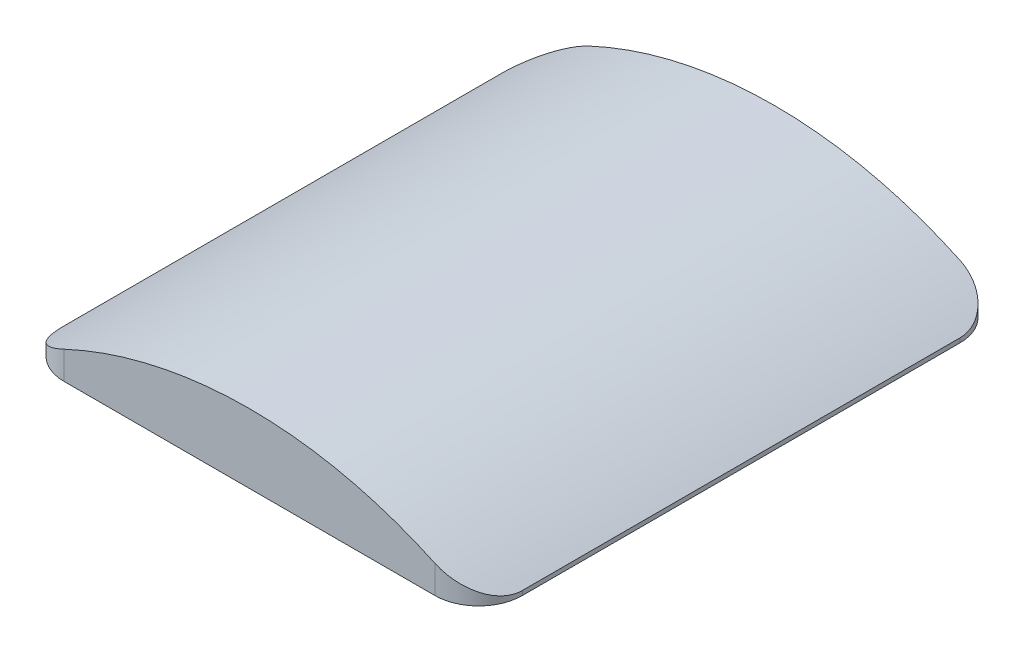
ISO-10303-21;
HEADER;
FILE_DESCRIPTION(('STEP AP214'),'2;1');
FILE_NAME('part.step','',(''),(''),'','','');
FILE_SCHEMA(('AUTOMOTIVE_DESIGN { 1 0 10303 214 1 1 1 1 }'));
ENDSEC;
DATA;
#1=APPLICATION_CONTEXT('core data for automotive mechanical design processes');
#2=APPLICATION_PROTOCOL_DEFINITION('international standard','automotive_design',2000,#1);
#3=PRODUCT_CONTEXT('',#1,'mechanical');
#4=PRODUCT('Part','Part','',(#3));
#5=PRODUCT_RELATED_PRODUCT_CATEGORY('part','',(#4));
#6=PRODUCT_DEFINITION_FORMATION('','',#4);
#7=PRODUCT_DEFINITION_CONTEXT('part definition',#1,'design');
#8=PRODUCT_DEFINITION('design','',#6,#7);
#9=PRODUCT_DEFINITION_SHAPE('','',#8);
#10=(LENGTH_UNIT() NAMED_UNIT(*) SI_UNIT(.MILLI.,.METRE.));
#11=(NAMED_UNIT(*) PLANE_ANGLE_UNIT() SI_UNIT($,.RADIAN.));
#12=(NAMED_UNIT(*) SI_UNIT($,.STERADIAN.) SOLID_ANGLE_UNIT());
#13=UNCERTAINTY_MEASURE_WITH_UNIT(LENGTH_MEASURE(1.E-05),#10,'distance_accuracy_value','');
#14=(GEOMETRIC_REPRESENTATION_CONTEXT(3) GLOBAL_UNCERTAINTY_ASSIGNED_CONTEXT((#13)) GLOBAL_UNIT_ASSIGNED_CONTEXT((#10,
#11,#12)) REPRESENTATION_CONTEXT('',''));
#15=CARTESIAN_POINT('',(0.,0.,0.));
#16=DIRECTION('',(0.,0.,1.));
#17=DIRECTION('',(1.,0.,0.));
#18=AXIS2_PLACEMENT_3D('',#15,#16,#17);
#19=CARTESIAN_POINT('',(0.,-111.055071696745,60.));
#20=DIRECTION('',(0.,0.,-1.));
#21=DIRECTION('',(-1.,0.,0.));
#22=AXIS2_PLACEMENT_3D('',#19,#20,#21);
#23=CYLINDRICAL_SURFACE('',#22,100.);
#24=DIRECTION('',(0.,0.,-1.));
#25=VECTOR('',#24,1.);
#26=CARTESIAN_POINT('',(-52.375,-25.8678697530253,60.));
#27=LINE('',#26,#25);
#28=CARTESIAN_POINT('',(-52.375,-25.8678697530253,50.));
#29=VERTEX_POINT('',#28);
#30=CARTESIAN_POINT('',(-52.375,-25.8678697530253,-50.));
#31=VERTEX_POINT('',#30);
#32=EDGE_CURVE('E115',#29,#31,#27,.T.);
#33=ORIENTED_EDGE('',*,*,#32,.F.);
#34=CARTESIAN_POINT('',(-52.375,-25.8678697530253,50.));
#35=CARTESIAN_POINT('',(-52.3750009471671,-25.8678707840457,50.1266693333499));
#36=CARTESIAN_POINT('',(-52.3725926924967,-25.8663896311386,50.2533213826519));
#37=CARTESIAN_POINT('',(-52.3629738020624,-25.8604766748798,50.506370588828));
#38=CARTESIAN_POINT('',(-52.3557632980753,-25.8560449524937,50.6327677526007));
#39=CARTESIAN_POINT('',(-52.3269649151145,-25.8383521672331,51.0110904456942));
#40=CARTESIAN_POINT('',(-52.2982101201286,-25.8206934489779,51.2623148478259));
#41=CARTESIAN_POINT('',(-52.2221814182102,-25.774090657108,51.7595421435745));
#42=CARTESIAN_POINT('',(-52.1750006156389,-25.7452033237094,52.0055648338298));
#43=CARTESIAN_POINT('',(-52.0627427729445,-25.6766485751876,52.4919742288888));
#44=CARTESIAN_POINT('',(-51.9976645765401,-25.636980463562,52.7323605684604));
#45=CARTESIAN_POINT('',(-51.8505459482255,-25.5475967589811,53.2055140409575));
#46=CARTESIAN_POINT('',(-51.7685327156521,-25.4978972802379,53.4382927065917));
#47=CARTESIAN_POINT('',(-51.5883881709189,-25.3891550745353,53.8953622575638));
#48=CARTESIAN_POINT('',(-51.490250721599,-25.3301087903317,54.1196498709079));
#49=CARTESIAN_POINT('',(-51.278834915068,-25.2034772376606,54.55863065259));
#50=CARTESIAN_POINT('',(-51.1655472272926,-25.1358867084719,54.7733177986938));
#51=CARTESIAN_POINT('',(-50.92489517716,-24.9930322165605,55.192075180805));
#52=CARTESIAN_POINT('',(-50.7975253887378,-24.9177652968704,55.396141279492));
#53=CARTESIAN_POINT('',(-50.5212367167712,-24.7554083369007,55.8054815393253));
#54=CARTESIAN_POINT('',(-50.3714610537722,-24.6678701842778,56.0100002644381));
#55=CARTESIAN_POINT('',(-50.0584399438832,-24.48610828394,56.4053412431879));
#56=CARTESIAN_POINT('',(-49.8951896311576,-24.3918821228517,56.5961585021601));
#57=CARTESIAN_POINT('',(-49.3870697603099,-24.1006626465862,57.1470412104243));
#58=CARTESIAN_POINT('',(-49.0236660675647,-23.8950306323007,57.4857798291961));
#59=CARTESIAN_POINT('',(-48.2032955590233,-23.438336042556,58.1452868881883));
#60=CARTESIAN_POINT('',(-47.740350021235,-23.184939689709,58.4569364854667));
#61=CARTESIAN_POINT('',(-46.7738158588621,-22.6666650527962,58.9976063158804));
#62=CARTESIAN_POINT('',(-46.2702031120208,-22.4017799978241,59.226577059905));
#63=CARTESIAN_POINT('',(-45.4823940445078,-21.9964129019381,59.5092880381407));
#64=CARTESIAN_POINT('',(-45.2084863291149,-21.8570384661203,59.5944552517181));
#65=CARTESIAN_POINT('',(-44.6542829057085,-21.5783089838926,59.7409938185742));
#66=CARTESIAN_POINT('',(-44.3739870781215,-21.4389539378948,59.8023647260429));
#67=CARTESIAN_POINT('',(-43.8088789160011,-21.1613508804501,59.9008185469047));
#68=CARTESIAN_POINT('',(-43.5240698003667,-21.0231021772759,59.9379180370159));
#69=CARTESIAN_POINT('',(-42.9514017286221,-20.7484906400652,59.9875116449344));
#70=CARTESIAN_POINT('',(-42.6635426166181,-20.6121279032551,60.000004498869));
#71=CARTESIAN_POINT('',(-42.375,-20.4771528919939,60.));
#72=B_SPLINE_CURVE_WITH_KNOTS('',3,(#34,#35,#36,#37,#38,#39,#40,#41,#42,#43,#44,#45,#46,#47,#48,
#49,#50,#51,#52,#53,#54,#55,#56,#57,#58,#59,#60,#61,#62,#63,#64,#65,#66,#67,#68,#69,#70,#71),
.UNSPECIFIED.,.F.,.F.,(4,2,2,2,2,2,2,2,2,2,2,2,2,2,2,2,2,2,4),(0.,0.379942177041865,
0.759873928652552,1.51923622068095,2.27481018338774,3.03043297227549,3.78485146653699,
4.53955777376276,5.29473104042065,6.05019630858995,6.85391716847215,7.65792954079915,
9.2650363240871,11.0966210391766,12.9293002762931,13.8852445752441,14.8412067823874,
15.796515409857,16.7518731036456),.UNSPECIFIED.);
#73=CARTESIAN_POINT('',(-42.375,-20.4771528919939,60.));
#74=VERTEX_POINT('',#73);
#75=EDGE_CURVE('E119',#29,#74,#72,.T.);
#76=ORIENTED_EDGE('',*,*,#75,.T.);
#77=CARTESIAN_POINT('',(0.,-111.055071696745,60.));
#78=DIRECTION('',(0.,0.,1.));
#79=DIRECTION('',(-1.,0.,0.));
#80=AXIS2_PLACEMENT_3D('',#77,#78,#79);
#81=CIRCLE('',#80,100.);
#82=CARTESIAN_POINT('',(42.375,-20.4771528919939,60.));
#83=VERTEX_POINT('',#82);
#84=EDGE_CURVE('E110',#83,#74,#81,.T.);
#85=ORIENTED_EDGE('',*,*,#84,.F.);
#86=CARTESIAN_POINT('',(42.375,-20.4771528919939,60.));
#87=CARTESIAN_POINT('',(42.6877110039925,-20.6234287925265,60.0000088541762));
#88=CARTESIAN_POINT('',(42.9996216909897,-20.7713422572446,59.9853330187966));
#89=CARTESIAN_POINT('',(43.6196815254015,-21.0692909286402,59.9271179982403));
#90=CARTESIAN_POINT('',(43.9278310316384,-21.2193259299253,59.8835815886737));
#91=CARTESIAN_POINT('',(44.5386339421851,-21.5205730643631,59.7680821649434));
#92=CARTESIAN_POINT('',(44.8412803253907,-21.6717863916697,59.6960851831028));
#93=CARTESIAN_POINT('',(45.4386734796721,-21.9739909761252,59.5242064618026));
#94=CARTESIAN_POINT('',(45.7334200713028,-22.1249822281561,59.4243240895093));
#95=CARTESIAN_POINT('',(46.3130307217046,-22.4254503736791,59.1972173565295));
#96=CARTESIAN_POINT('',(46.5978938552864,-22.5749271244766,59.0699904441012));
#97=CARTESIAN_POINT('',(47.1557954529748,-22.8709987797274,58.7887211233992));
#98=CARTESIAN_POINT('',(47.4288297622483,-23.0175926618673,58.6346693868478));
#99=CARTESIAN_POINT('',(47.9608177003172,-23.3062738014487,58.3004391714609));
#100=CARTESIAN_POINT('',(48.2197755431865,-23.4483624022699,58.1202685717239));
#101=CARTESIAN_POINT('',(48.7215358942171,-23.7264153935262,57.7344444637209));
#102=CARTESIAN_POINT('',(48.9643382660906,-23.8623797322939,57.5287907405209));
#103=CARTESIAN_POINT('',(49.4250918164394,-24.1227508094527,57.0987867488168));
#104=CARTESIAN_POINT('',(49.6435404819858,-24.247371740207,56.8751001874626));
#105=CARTESIAN_POINT('',(50.0605911104598,-24.4872077943359,56.4054852046686));
#106=CARTESIAN_POINT('',(50.2592032449126,-24.6024277326256,56.1595683067473));
#107=CARTESIAN_POINT('',(50.6342727496665,-24.8215653705059,55.6467089571112));
#108=CARTESIAN_POINT('',(50.8107330722182,-24.925484575938,55.3797693149054));
#109=CARTESIAN_POINT('',(51.138993247946,-25.1199811429977,54.8265725633632));
#110=CARTESIAN_POINT('',(51.2907987165526,-25.2105615422543,54.5403198738808));
#111=CARTESIAN_POINT('',(51.5501955183131,-25.3661148683073,53.9871377973997));
#112=CARTESIAN_POINT('',(51.6609309782795,-25.4328683082964,53.7221807890736));
#113=CARTESIAN_POINT('',(51.859917407665,-25.5532441909158,53.1810974823025));
#114=CARTESIAN_POINT('',(51.9481734372386,-25.6068695885829,52.9049737137579));
#115=CARTESIAN_POINT('',(52.1005917877365,-25.6997186454009,52.3445654337312));
#116=CARTESIAN_POINT('',(52.1648149206886,-25.7389786485891,52.060303506172));
#117=CARTESIAN_POINT('',(52.2683092205703,-25.8023440825744,51.4857681491481));
#118=CARTESIAN_POINT('',(52.3075996915366,-25.8264612375223,51.1954995505881));
#119=CARTESIAN_POINT('',(52.3477088309468,-25.8510952356946,50.7535606681352));
#120=CARTESIAN_POINT('',(52.3579443326799,-25.8573853353737,50.6029939436276));
#121=CARTESIAN_POINT('',(52.3715867187035,-25.8657710965564,50.3016269710019));
#122=CARTESIAN_POINT('',(52.375002261134,-25.8678720762666,50.1508272625165));
#123=CARTESIAN_POINT('',(52.375,-25.8678697530253,50.));
#124=B_SPLINE_CURVE_WITH_KNOTS('',3,(#86,#87,#88,#89,#90,#91,#92,#93,#94,#95,#96,#97,#98,#99,
#100,#101,#102,#103,#104,#105,#106,#107,#108,#109,#110,#111,#112,#113,#114,#115,#116,#117,#118,
#119,#120,#121,#122,#123),.UNSPECIFIED.,.F.,.F.,(4,2,2,2,2,2,2,2,2,2,2,2,2,2,2,2,2,2,4),(0.,
1.0353348432009,2.07057012951465,3.10704471713237,4.14354282851406,5.18013770600395,
6.21709377976894,7.25373769053163,8.29039034532926,9.29874169676472,10.3065733149989,
11.3142704730175,12.321737793409,13.2049240101354,14.0879112442277,14.9686488418396,
15.8487036963901,16.3016531983623,16.7540273010082),.UNSPECIFIED.);
#125=CARTESIAN_POINT('',(52.375,-25.8678697530253,50.));
#126=VERTEX_POINT('',#125);
#127=EDGE_CURVE('E56',#83,#126,#124,.T.);
#128=ORIENTED_EDGE('',*,*,#127,.T.);
#129=DIRECTION('',(0.,0.,-1.));
#130=VECTOR('',#129,1.);
#131=CARTESIAN_POINT('',(52.375,-25.8678697530253,60.));
#132=LINE('',#131,#130);
#133=CARTESIAN_POINT('',(52.375,-25.8678697530253,-50.));
#134=VERTEX_POINT('',#133);
#135=EDGE_CURVE('E122',#126,#134,#132,.T.);
#136=ORIENTED_EDGE('',*,*,#135,.T.);
#137=CARTESIAN_POINT('',(52.375,-25.8678697530253,-50.));
#138=CARTESIAN_POINT('',(52.3750009471671,-25.8678707840457,-50.1266693333499));
#139=CARTESIAN_POINT('',(52.3725926924967,-25.8663896311386,-50.2533213826519));
#140=CARTESIAN_POINT('',(52.3629738020624,-25.8604766748798,-50.506370588828));
#141=CARTESIAN_POINT('',(52.3557632980753,-25.8560449524937,-50.6327677526007));
#142=CARTESIAN_POINT('',(52.3269649151145,-25.8383521672331,-51.0110904456942));
#143=CARTESIAN_POINT('',(52.2982101201286,-25.8206934489779,-51.2623148478259));
#144=CARTESIAN_POINT('',(52.2221814182102,-25.774090657108,-51.7595421435745));
#145=CARTESIAN_POINT('',(52.1750006156389,-25.7452033237094,-52.0055648338298));
#146=CARTESIAN_POINT('',(52.0627427729445,-25.6766485751876,-52.4919742288888));
#147=CARTESIAN_POINT('',(51.9976645765401,-25.636980463562,-52.7323605684604));
#148=CARTESIAN_POINT('',(51.8505459482255,-25.5475967589811,-53.2055140409575));
#149=CARTESIAN_POINT('',(51.7685327156521,-25.4978972802379,-53.4382927065917));
#150=CARTESIAN_POINT('',(51.5883881709189,-25.3891550745353,-53.8953622575638));
#151=CARTESIAN_POINT('',(51.490250721599,-25.3301087903317,-54.1196498709079));
#152=CARTESIAN_POINT('',(51.278834915068,-25.2034772376606,-54.55863065259));
#153=CARTESIAN_POINT('',(51.1655472272926,-25.1358867084719,-54.7733177986938));
#154=CARTESIAN_POINT('',(50.92489517716,-24.9930322165605,-55.1920751808049));
#155=CARTESIAN_POINT('',(50.7975253887378,-24.9177652968704,-55.396141279492));
#156=CARTESIAN_POINT('',(50.5212367167712,-24.7554083369007,-55.8054815393253));
#157=CARTESIAN_POINT('',(50.3714610537722,-24.6678701842778,-56.0100002644381));
#158=CARTESIAN_POINT('',(50.0584399438832,-24.48610828394,-56.4053412431879));
#159=CARTESIAN_POINT('',(49.8951896311576,-24.3918821228517,-56.5961585021601));
#160=CARTESIAN_POINT('',(49.3870697603099,-24.1006626465862,-57.1470412104243));
#161=CARTESIAN_POINT('',(49.0236660675647,-23.8950306323007,-57.4857798291961));
#162=CARTESIAN_POINT('',(48.2032955590233,-23.438336042556,-58.1452868881883));
#163=CARTESIAN_POINT('',(47.740350021235,-23.184939689709,-58.4569364854667));
#164=CARTESIAN_POINT('',(46.7738158588621,-22.6666650527962,-58.9976063158804));
#165=CARTESIAN_POINT('',(46.2702031120208,-22.4017799978241,-59.226577059905));
#166=CARTESIAN_POINT('',(45.4823940445078,-21.9964129019381,-59.5092880381407));
#167=CARTESIAN_POINT('',(45.2084863291149,-21.8570384661203,-59.5944552517181));
#168=CARTESIAN_POINT('',(44.6542829057085,-21.5783089838926,-59.7409938185742));
#169=CARTESIAN_POINT('',(44.3739870781215,-21.4389539378948,-59.8023647260429));
#170=CARTESIAN_POINT('',(43.8088789160011,-21.1613508804501,-59.9008185469047));
#171=CARTESIAN_POINT('',(43.5240698003667,-21.0231021772759,-59.9379180370159));
#172=CARTESIAN_POINT('',(42.9514017286221,-20.7484906400652,-59.9875116449344));
#173=CARTESIAN_POINT('',(42.6635426166181,-20.6121279032551,-60.000004498869));
#174=CARTESIAN_POINT('',(42.375,-20.4771528919939,-60.));
#175=B_SPLINE_CURVE_WITH_KNOTS('',3,(#137,#138,#139,#140,#141,#142,#143,#144,#145,#146,#147,
#148,#149,#150,#151,#152,#153,#154,#155,#156,#157,#158,#159,#160,#161,#162,#163,#164,#165,#166,
#167,#168,#169,#170,#171,#172,#173,#174),.UNSPECIFIED.,.F.,.F.,(4,2,2,2,2,2,2,2,2,2,2,2,2,2,2,2,
2,2,4),(0.,0.379942177041866,0.759873928652559,1.51923622068096,2.27481018338775,
3.03043297227549,3.78485146653698,4.53955777376276,5.29473104042066,6.05019630858995,
6.85391716847215,7.65792954079915,9.2650363240871,11.0966210391766,12.9293002762931,
13.8852445752441,14.8412067823874,15.796515409857,16.7518731036456),.UNSPECIFIED.);
#176=CARTESIAN_POINT('',(42.375,-20.4771528919939,-60.));
#177=VERTEX_POINT('',#176);
#178=EDGE_CURVE('E49',#134,#177,#175,.T.);
#179=ORIENTED_EDGE('',*,*,#178,.T.);
#180=CARTESIAN_POINT('',(0.,-111.055071696745,-60.));
#181=DIRECTION('',(0.,0.,1.));
#182=DIRECTION('',(-1.,0.,0.));
#183=AXIS2_PLACEMENT_3D('',#180,#181,#182);
#184=CIRCLE('',#183,100.);
#185=CARTESIAN_POINT('',(-42.375,-20.4771528919939,-60.));
#186=VERTEX_POINT('',#185);
#187=EDGE_CURVE('E125',#177,#186,#184,.T.);
#188=ORIENTED_EDGE('',*,*,#187,.T.);
#189=CARTESIAN_POINT('',(-42.375,-20.4771528919939,-60.));
#190=CARTESIAN_POINT('',(-42.6877110039925,-20.6234287925265,-60.0000088541762));
#191=CARTESIAN_POINT('',(-42.9996216909897,-20.7713422572446,-59.9853330187966));
#192=CARTESIAN_POINT('',(-43.6196815254015,-21.0692909286402,-59.9271179982403));
#193=CARTESIAN_POINT('',(-43.9278310316384,-21.2193259299253,-59.8835815886737));
#194=CARTESIAN_POINT('',(-44.5386339421851,-21.5205730643631,-59.7680821649434));
#195=CARTESIAN_POINT('',(-44.8412803253907,-21.6717863916697,-59.6960851831028));
#196=CARTESIAN_POINT('',(-45.4386734796721,-21.9739909761252,-59.5242064618026));
#197=CARTESIAN_POINT('',(-45.7334200713028,-22.1249822281561,-59.4243240895093));
#198=CARTESIAN_POINT('',(-46.3130307217046,-22.4254503736791,-59.1972173565295));
#199=CARTESIAN_POINT('',(-46.5978938552864,-22.5749271244766,-59.0699904441012));
#200=CARTESIAN_POINT('',(-47.1557954529748,-22.8709987797274,-58.7887211233992));
#201=CARTESIAN_POINT('',(-47.4288297622483,-23.0175926618673,-58.6346693868478));
#202=CARTESIAN_POINT('',(-47.9608177003172,-23.3062738014487,-58.3004391714609));
#203=CARTESIAN_POINT('',(-48.2197755431865,-23.4483624022699,-58.1202685717239));
#204=CARTESIAN_POINT('',(-48.7215358942171,-23.7264153935262,-57.7344444637209));
#205=CARTESIAN_POINT('',(-48.9643382660906,-23.8623797322939,-57.5287907405208));
#206=CARTESIAN_POINT('',(-49.4250918164394,-24.1227508094527,-57.0987867488167));
#207=CARTESIAN_POINT('',(-49.6435404819858,-24.247371740207,-56.8751001874626));
#208=CARTESIAN_POINT('',(-50.0605911104598,-24.4872077943359,-56.4054852046686));
#209=CARTESIAN_POINT('',(-50.2592032449126,-24.6024277326256,-56.1595683067473));
#210=CARTESIAN_POINT('',(-50.6342727496666,-24.8215653705059,-55.6467089571112));
#211=CARTESIAN_POINT('',(-50.8107330722182,-24.925484575938,-55.3797693149054));
#212=CARTESIAN_POINT('',(-51.138993247946,-25.1199811429977,-54.8265725633632));
#213=CARTESIAN_POINT('',(-51.2907987165526,-25.2105615422543,-54.5403198738808));
#214=CARTESIAN_POINT('',(-51.5501955183131,-25.3661148683073,-53.9871377973997));
#215=CARTESIAN_POINT('',(-51.6609309782795,-25.4328683082964,-53.7221807890736));
#216=CARTESIAN_POINT('',(-51.859917407665,-25.5532441909158,-53.1810974823025));
#217=CARTESIAN_POINT('',(-51.9481734372386,-25.6068695885829,-52.9049737137579));
#218=CARTESIAN_POINT('',(-52.1005917877366,-25.6997186454009,-52.3445654337312));
#219=CARTESIAN_POINT('',(-52.1648149206886,-25.7389786485891,-52.060303506172));
#220=CARTESIAN_POINT('',(-52.2683092205703,-25.8023440825744,-51.4857681491481));
#221=CARTESIAN_POINT('',(-52.3075996915366,-25.8264612375223,-51.1954995505881));
#222=CARTESIAN_POINT('',(-52.3477088309468,-25.8510952356946,-50.7535606681351));
#223=CARTESIAN_POINT('',(-52.3579443326799,-25.8573853353737,-50.6029939436276));
#224=CARTESIAN_POINT('',(-52.3715867187035,-25.8657710965564,-50.3016269710019));
#225=CARTESIAN_POINT('',(-52.375002261134,-25.8678720762667,-50.1508272625165));
#226=CARTESIAN_POINT('',(-52.375,-25.8678697530253,-50.));
#227=B_SPLINE_CURVE_WITH_KNOTS('',3,(#189,#190,#191,#192,#193,#194,#195,#196,#197,#198,#199,
#200,#201,#202,#203,#204,#205,#206,#207,#208,#209,#210,#211,#212,#213,#214,#215,#216,#217,#218,
#219,#220,#221,#222,#223,#224,#225,#226),.UNSPECIFIED.,.F.,.F.,(4,2,2,2,2,2,2,2,2,2,2,2,2,2,2,2,
2,2,4),(0.,1.0353348432009,2.07057012951466,3.10704471713237,4.14354282851406,5.18013770600395,
6.21709377976893,7.25373769053163,8.29039034532926,9.29874169676472,10.3065733149989,
11.3142704730175,12.3217377934089,13.2049240101354,14.0879112442277,14.9686488418396,
15.8487036963901,16.3016531983623,16.7540273010082),.UNSPECIFIED.);
#228=EDGE_CURVE('E175',#186,#31,#227,.T.);
#229=ORIENTED_EDGE('',*,*,#228,.T.);
#230=EDGE_LOOP('',(#33,#76,#85,#128,#136,#179,#188,#229));
#231=FACE_BOUND('',#230,.T.);
#232=ADVANCED_FACE('F33',(#231),#23,.T.);
#233=CARTESIAN_POINT('',(-52.375,-26.8678697530253,60.));
#234=DIRECTION('',(1.,0.,0.));
#235=DIRECTION('',(0.,0.,-1.));
#236=AXIS2_PLACEMENT_3D('',#233,#234,#235);
#237=PLANE('',#236);
#238=DIRECTION('',(0.,0.,-1.));
#239=VECTOR('',#238,1.);
#240=CARTESIAN_POINT('',(-52.375,-26.8678697530253,60.));
#241=LINE('',#240,#239);
#242=CARTESIAN_POINT('',(-52.375,-26.8678697530253,50.));
#243=VERTEX_POINT('',#242);
#244=CARTESIAN_POINT('',(-52.375,-26.8678697530253,-50.));
#245=VERTEX_POINT('',#244);
#246=EDGE_CURVE('E134',#243,#245,#241,.T.);
#247=ORIENTED_EDGE('',*,*,#246,.F.);
#248=DIRECTION('',(0.,-1.,0.));
#249=VECTOR('',#248,1.);
#250=CARTESIAN_POINT('',(-52.375,-26.8678697530253,50.));
#251=LINE('',#250,#249);
#252=EDGE_CURVE('E103',#243,#29,#251,.F.);
#253=ORIENTED_EDGE('',*,*,#252,.T.);
#254=ORIENTED_EDGE('',*,*,#32,.T.);
#255=DIRECTION('',(0.,-1.,0.));
#256=VECTOR('',#255,1.);
#257=CARTESIAN_POINT('',(-52.375,-26.8678697530253,-50.));
#258=LINE('',#257,#256);
#259=EDGE_CURVE('E148',#31,#245,#258,.T.);
#260=ORIENTED_EDGE('',*,*,#259,.T.);
#261=EDGE_LOOP('',(#247,#253,#254,#260));
#262=FACE_BOUND('',#261,.T.);
#263=ADVANCED_FACE('F166',(#262),#237,.F.);
#264=CARTESIAN_POINT('',(52.375,-26.8678697530253,60.));
#265=DIRECTION('',(0.,1.,0.));
#266=DIRECTION('',(0.,0.,1.));
#267=AXIS2_PLACEMENT_3D('',#264,#265,#266);
#268=PLANE('',#267);
#269=DIRECTION('',(1.,0.,0.));
#270=VECTOR('',#269,1.);
#271=CARTESIAN_POINT('',(52.375,-26.8678697530253,60.));
#272=LINE('',#271,#270);
#273=CARTESIAN_POINT('',(-42.375,-26.8678697530253,60.));
#274=VERTEX_POINT('',#273);
#275=CARTESIAN_POINT('',(42.375,-26.8678697530253,60.));
#276=VERTEX_POINT('',#275);
#277=EDGE_CURVE('E113',#274,#276,#272,.T.);
#278=ORIENTED_EDGE('',*,*,#277,.F.);
#279=CARTESIAN_POINT('',(-42.375,-26.8678697530253,50.));
#280=DIRECTION('',(0.,1.,0.));
#281=DIRECTION('',(0.,0.,1.));
#282=AXIS2_PLACEMENT_3D('',#279,#280,#281);
#283=CIRCLE('',#282,10.);
#284=EDGE_CURVE('E146',#274,#243,#283,.F.);
#285=ORIENTED_EDGE('',*,*,#284,.T.);
#286=ORIENTED_EDGE('',*,*,#246,.T.);
#287=CARTESIAN_POINT('',(-42.375,-26.8678697530253,-50.));
#288=DIRECTION('',(0.,1.,0.));
#289=DIRECTION('',(0.,0.,1.));
#290=AXIS2_PLACEMENT_3D('',#287,#288,#289);
#291=CIRCLE('',#290,10.);
#292=CARTESIAN_POINT('',(-42.375,-26.8678697530253,-60.));
#293=VERTEX_POINT('',#292);
#294=EDGE_CURVE('E144',#245,#293,#291,.F.);
#295=ORIENTED_EDGE('',*,*,#294,.T.);
#296=DIRECTION('',(1.,0.,0.));
#297=VECTOR('',#296,1.);
#298=CARTESIAN_POINT('',(52.375,-26.8678697530253,-60.));
#299=LINE('',#298,#297);
#300=CARTESIAN_POINT('',(42.375,-26.8678697530253,-60.));
#301=VERTEX_POINT('',#300);
#302=EDGE_CURVE('E120',#293,#301,#299,.T.);
#303=ORIENTED_EDGE('',*,*,#302,.T.);
#304=CARTESIAN_POINT('',(42.375,-26.8678697530253,-50.));
#305=DIRECTION('',(0.,1.,0.));
#306=DIRECTION('',(0.,0.,1.));
#307=AXIS2_PLACEMENT_3D('',#304,#305,#306);
#308=CIRCLE('',#307,10.);
#309=CARTESIAN_POINT('',(52.375,-26.8678697530253,-50.));
#310=VERTEX_POINT('',#309);
#311=EDGE_CURVE('E142',#301,#310,#308,.F.);
#312=ORIENTED_EDGE('',*,*,#311,.T.);
#313=DIRECTION('',(0.,0.,-1.));
#314=VECTOR('',#313,1.);
#315=CARTESIAN_POINT('',(52.375,-26.8678697530253,60.));
#316=LINE('',#315,#314);
#317=CARTESIAN_POINT('',(52.375,-26.8678697530253,50.));
#318=VERTEX_POINT('',#317);
#319=EDGE_CURVE('E131',#318,#310,#316,.T.);
#320=ORIENTED_EDGE('',*,*,#319,.F.);
#321=CARTESIAN_POINT('',(42.375,-26.8678697530253,50.));
#322=DIRECTION('',(0.,1.,0.));
#323=DIRECTION('',(0.,0.,1.));
#324=AXIS2_PLACEMENT_3D('',#321,#322,#323);
#325=CIRCLE('',#324,10.);
#326=EDGE_CURVE('E140',#318,#276,#325,.F.);
#327=ORIENTED_EDGE('',*,*,#326,.T.);
#328=EDGE_LOOP('',(#278,#285,#286,#295,#303,#312,#320,#327));
#329=FACE_BOUND('',#328,.T.);
#330=ADVANCED_FACE('F199',(#329),#268,.F.);
#331=CARTESIAN_POINT('',(52.375,-25.8678697530253,60.));
#332=DIRECTION('',(-1.,0.,0.));
#333=DIRECTION('',(0.,0.,1.));
#334=AXIS2_PLACEMENT_3D('',#331,#332,#333);
#335=PLANE('',#334);
#336=ORIENTED_EDGE('',*,*,#319,.T.);
#337=DIRECTION('',(0.,1.,0.));
#338=VECTOR('',#337,1.);
#339=CARTESIAN_POINT('',(52.375,-25.8678697530253,-50.));
#340=LINE('',#339,#338);
#341=EDGE_CURVE('E11',#310,#134,#340,.T.);
#342=ORIENTED_EDGE('',*,*,#341,.T.);
#343=ORIENTED_EDGE('',*,*,#135,.F.);
#344=DIRECTION('',(0.,1.,0.));
#345=VECTOR('',#344,1.);
#346=CARTESIAN_POINT('',(52.375,-25.8678697530253,50.));
#347=LINE('',#346,#345);
#348=EDGE_CURVE('E42',#126,#318,#347,.F.);
#349=ORIENTED_EDGE('',*,*,#348,.T.);
#350=EDGE_LOOP('',(#336,#342,#343,#349));
#351=FACE_BOUND('',#350,.T.);
#352=ADVANCED_FACE('F202',(#351),#335,.F.);
#353=CARTESIAN_POINT('',(0.,-111.055071696745,60.));
#354=DIRECTION('',(0.,0.,-1.));
#355=DIRECTION('',(-1.,0.,0.));
#356=AXIS2_PLACEMENT_3D('',#353,#354,#355);
#357=PLANE('',#356);
#358=ORIENTED_EDGE('',*,*,#84,.T.);
#359=DIRECTION('',(0.,-1.,0.));
#360=VECTOR('',#359,1.);
#361=CARTESIAN_POINT('',(-42.375,-111.055071696745,60.));
#362=LINE('',#361,#360);
#363=EDGE_CURVE('E114',#74,#274,#362,.T.);
#364=ORIENTED_EDGE('',*,*,#363,.T.);
#365=ORIENTED_EDGE('',*,*,#277,.T.);
#366=DIRECTION('',(0.,1.,0.));
#367=VECTOR('',#366,1.);
#368=CARTESIAN_POINT('',(42.375,-111.055071696745,60.));
#369=LINE('',#368,#367);
#370=EDGE_CURVE('E102',#276,#83,#369,.T.);
#371=ORIENTED_EDGE('',*,*,#370,.T.);
#372=EDGE_LOOP('',(#358,#364,#365,#371));
#373=FACE_BOUND('',#372,.T.);
#374=ADVANCED_FACE('F108',(#373),#357,.F.);
#375=CARTESIAN_POINT('',(0.,-111.055071696745,-60.));
#376=DIRECTION('',(0.,0.,-1.));
#377=DIRECTION('',(-1.,0.,0.));
#378=AXIS2_PLACEMENT_3D('',#375,#376,#377);
#379=PLANE('',#378);
#380=ORIENTED_EDGE('',*,*,#302,.F.);
#381=DIRECTION('',(0.,-1.,0.));
#382=VECTOR('',#381,1.);
#383=CARTESIAN_POINT('',(-42.375,-25.8678697530253,-60.));
#384=LINE('',#383,#382);
#385=EDGE_CURVE('E203',#293,#186,#384,.F.);
#386=ORIENTED_EDGE('',*,*,#385,.T.);
#387=ORIENTED_EDGE('',*,*,#187,.F.);
#388=DIRECTION('',(0.,1.,0.));
#389=VECTOR('',#388,1.);
#390=CARTESIAN_POINT('',(42.375,-26.8678697530253,-60.));
#391=LINE('',#390,#389);
#392=EDGE_CURVE('E196',#177,#301,#391,.F.);
#393=ORIENTED_EDGE('',*,*,#392,.T.);
#394=EDGE_LOOP('',(#380,#386,#387,#393));
#395=FACE_BOUND('',#394,.T.);
#396=ADVANCED_FACE('F207',(#395),#379,.T.);
#397=CARTESIAN_POINT('',(-42.375,-111.055071696745,50.));
#398=DIRECTION('',(0.,-1.,0.));
#399=DIRECTION('',(0.,0.,-1.));
#400=AXIS2_PLACEMENT_3D('',#397,#398,#399);
#401=CYLINDRICAL_SURFACE('',#400,10.);
#402=ORIENTED_EDGE('',*,*,#75,.F.);
#403=ORIENTED_EDGE('',*,*,#252,.F.);
#404=ORIENTED_EDGE('',*,*,#284,.F.);
#405=ORIENTED_EDGE('',*,*,#363,.F.);
#406=EDGE_LOOP('',(#402,#403,#404,#405));
#407=FACE_BOUND('',#406,.T.);
#408=ADVANCED_FACE('F168',(#407),#401,.T.);
#409=CARTESIAN_POINT('',(-42.375,-26.8678697530253,-50.));
#410=DIRECTION('',(0.,1.,0.));
#411=DIRECTION('',(0.,0.,1.));
#412=AXIS2_PLACEMENT_3D('',#409,#410,#411);
#413=CYLINDRICAL_SURFACE('',#412,10.);
#414=ORIENTED_EDGE('',*,*,#228,.F.);
#415=ORIENTED_EDGE('',*,*,#385,.F.);
#416=ORIENTED_EDGE('',*,*,#294,.F.);
#417=ORIENTED_EDGE('',*,*,#259,.F.);
#418=EDGE_LOOP('',(#414,#415,#416,#417));
#419=FACE_BOUND('',#418,.T.);
#420=ADVANCED_FACE('F185',(#419),#413,.T.);
#421=CARTESIAN_POINT('',(42.375,-25.8678697530253,-50.));
#422=DIRECTION('',(0.,-1.,0.));
#423=DIRECTION('',(0.,0.,-1.));
#424=AXIS2_PLACEMENT_3D('',#421,#422,#423);
#425=CYLINDRICAL_SURFACE('',#424,10.);
#426=ORIENTED_EDGE('',*,*,#311,.F.);
#427=ORIENTED_EDGE('',*,*,#392,.F.);
#428=ORIENTED_EDGE('',*,*,#178,.F.);
#429=ORIENTED_EDGE('',*,*,#341,.F.);
#430=EDGE_LOOP('',(#426,#427,#428,#429));
#431=FACE_BOUND('',#430,.T.);
#432=ADVANCED_FACE('F188',(#431),#425,.T.);
#433=CARTESIAN_POINT('',(42.375,-111.055071696745,50.));
#434=DIRECTION('',(0.,1.,0.));
#435=DIRECTION('',(0.,0.,1.));
#436=AXIS2_PLACEMENT_3D('',#433,#434,#435);
#437=CYLINDRICAL_SURFACE('',#436,10.);
#438=ORIENTED_EDGE('',*,*,#326,.F.);
#439=ORIENTED_EDGE('',*,*,#348,.F.);
#440=ORIENTED_EDGE('',*,*,#127,.F.);
#441=ORIENTED_EDGE('',*,*,#370,.F.);
#442=EDGE_LOOP('',(#438,#439,#440,#441));
#443=FACE_BOUND('',#442,.T.);
#444=ADVANCED_FACE('F35',(#443),#437,.T.);
#445=CLOSED_SHELL('',(#232,#263,#330,#352,#374,#396,#408,#420,#432,#444));
#446=MANIFOLD_SOLID_BREP('B2',#445);
#447=ADVANCED_BREP_SHAPE_REPRESENTATION('',(#18,#446),#14);
#448=SHAPE_DEFINITION_REPRESENTATION(#9,#447);
ENDSEC;
END-ISO-10303-21;
